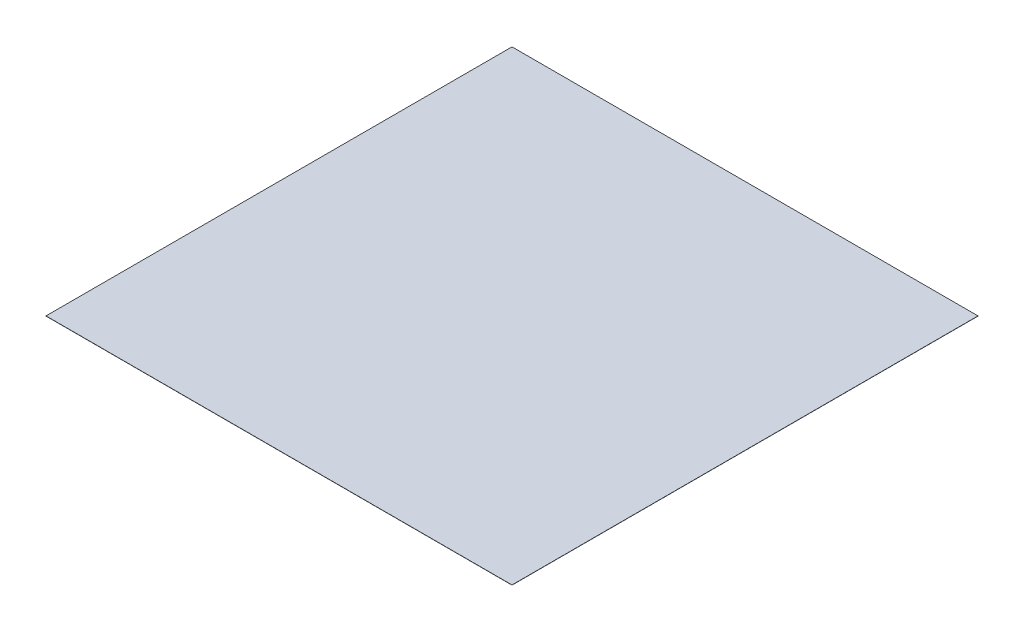
ISO-10303-21;
HEADER;
FILE_DESCRIPTION(('STEP AP214'),'2;1');
FILE_NAME('part.step','',(''),(''),'','','');
FILE_SCHEMA(('AUTOMOTIVE_DESIGN { 1 0 10303 214 1 1 1 1 }'));
ENDSEC;
DATA;
#1=APPLICATION_CONTEXT('core data for automotive mechanical design processes');
#2=APPLICATION_PROTOCOL_DEFINITION('international standard','automotive_design',2000,#1);
#3=PRODUCT_CONTEXT('',#1,'mechanical');
#4=PRODUCT('Part','Part','',(#3));
#5=PRODUCT_RELATED_PRODUCT_CATEGORY('part','',(#4));
#6=PRODUCT_DEFINITION_FORMATION('','',#4);
#7=PRODUCT_DEFINITION_CONTEXT('part definition',#1,'design');
#8=PRODUCT_DEFINITION('design','',#6,#7);
#9=PRODUCT_DEFINITION_SHAPE('','',#8);
#10=(LENGTH_UNIT() NAMED_UNIT(*) SI_UNIT(.MILLI.,.METRE.));
#11=(NAMED_UNIT(*) PLANE_ANGLE_UNIT() SI_UNIT($,.RADIAN.));
#12=(NAMED_UNIT(*) SI_UNIT($,.STERADIAN.) SOLID_ANGLE_UNIT());
#13=UNCERTAINTY_MEASURE_WITH_UNIT(LENGTH_MEASURE(1.E-05),#10,'distance_accuracy_value','');
#14=(GEOMETRIC_REPRESENTATION_CONTEXT(3) GLOBAL_UNCERTAINTY_ASSIGNED_CONTEXT((#13)) GLOBAL_UNIT_ASSIGNED_CONTEXT((#10,
#11,#12)) REPRESENTATION_CONTEXT('',''));
#15=CARTESIAN_POINT('',(0.,0.,0.));
#16=DIRECTION('',(0.,0.,1.));
#17=DIRECTION('',(1.,0.,0.));
#18=AXIS2_PLACEMENT_3D('',#15,#16,#17);
#19=CARTESIAN_POINT('',(2500.,2.,2500.));
#20=DIRECTION('',(-1.,0.,0.));
#21=DIRECTION('',(0.,0.,1.));
#22=AXIS2_PLACEMENT_3D('',#19,#20,#21);
#23=PLANE('',#22);
#24=DIRECTION('',(0.,0.,-1.));
#25=VECTOR('',#24,1.);
#26=CARTESIAN_POINT('',(2500.,0.,2500.));
#27=LINE('',#26,#25);
#28=CARTESIAN_POINT('',(2500.,0.,2500.));
#29=VERTEX_POINT('',#28);
#30=CARTESIAN_POINT('',(2500.,0.,-2500.));
#31=VERTEX_POINT('',#30);
#32=EDGE_CURVE('E107',#29,#31,#27,.T.);
#33=ORIENTED_EDGE('',*,*,#32,.T.);
#34=DIRECTION('',(0.,-1.,0.));
#35=VECTOR('',#34,1.);
#36=CARTESIAN_POINT('',(2500.,2.,-2500.));
#37=LINE('',#36,#35);
#38=CARTESIAN_POINT('',(2500.,2.,-2500.));
#39=VERTEX_POINT('',#38);
#40=EDGE_CURVE('E11',#39,#31,#37,.T.);
#41=ORIENTED_EDGE('',*,*,#40,.F.);
#42=DIRECTION('',(0.,0.,-1.));
#43=VECTOR('',#42,1.);
#44=CARTESIAN_POINT('',(2500.,2.,2500.));
#45=LINE('',#44,#43);
#46=CARTESIAN_POINT('',(2500.,2.,2500.));
#47=VERTEX_POINT('',#46);
#48=EDGE_CURVE('E91',#47,#39,#45,.T.);
#49=ORIENTED_EDGE('',*,*,#48,.F.);
#50=DIRECTION('',(0.,-1.,0.));
#51=VECTOR('',#50,1.);
#52=CARTESIAN_POINT('',(2500.,2.,2500.));
#53=LINE('',#52,#51);
#54=EDGE_CURVE('E103',#47,#29,#53,.T.);
#55=ORIENTED_EDGE('',*,*,#54,.T.);
#56=EDGE_LOOP('',(#33,#41,#49,#55));
#57=FACE_BOUND('',#56,.T.);
#58=ADVANCED_FACE('F39',(#57),#23,.F.);
#59=CARTESIAN_POINT('',(-2500.,2.,-2500.));
#60=DIRECTION('',(0.,0.,1.));
#61=DIRECTION('',(1.,0.,0.));
#62=AXIS2_PLACEMENT_3D('',#59,#60,#61);
#63=PLANE('',#62);
#64=DIRECTION('',(-1.,0.,0.));
#65=VECTOR('',#64,1.);
#66=CARTESIAN_POINT('',(-2500.,0.,-2500.));
#67=LINE('',#66,#65);
#68=CARTESIAN_POINT('',(-2500.,0.,-2500.));
#69=VERTEX_POINT('',#68);
#70=EDGE_CURVE('E96',#31,#69,#67,.T.);
#71=ORIENTED_EDGE('',*,*,#70,.T.);
#72=DIRECTION('',(0.,-1.,0.));
#73=VECTOR('',#72,1.);
#74=CARTESIAN_POINT('',(-2500.,2.,-2500.));
#75=LINE('',#74,#73);
#76=CARTESIAN_POINT('',(-2500.,2.,-2500.));
#77=VERTEX_POINT('',#76);
#78=EDGE_CURVE('E48',#77,#69,#75,.T.);
#79=ORIENTED_EDGE('',*,*,#78,.F.);
#80=DIRECTION('',(-1.,0.,0.));
#81=VECTOR('',#80,1.);
#82=CARTESIAN_POINT('',(-2500.,2.,-2500.));
#83=LINE('',#82,#81);
#84=EDGE_CURVE('E86',#39,#77,#83,.T.);
#85=ORIENTED_EDGE('',*,*,#84,.F.);
#86=ORIENTED_EDGE('',*,*,#40,.T.);
#87=EDGE_LOOP('',(#71,#79,#85,#86));
#88=FACE_BOUND('',#87,.T.);
#89=ADVANCED_FACE('F95',(#88),#63,.F.);
#90=CARTESIAN_POINT('',(-2500.,2.,2500.));
#91=DIRECTION('',(1.,0.,0.));
#92=DIRECTION('',(0.,0.,-1.));
#93=AXIS2_PLACEMENT_3D('',#90,#91,#92);
#94=PLANE('',#93);
#95=DIRECTION('',(0.,0.,1.));
#96=VECTOR('',#95,1.);
#97=CARTESIAN_POINT('',(-2500.,0.,2500.));
#98=LINE('',#97,#96);
#99=CARTESIAN_POINT('',(-2500.,0.,2500.));
#100=VERTEX_POINT('',#99);
#101=EDGE_CURVE('E73',#69,#100,#98,.T.);
#102=ORIENTED_EDGE('',*,*,#101,.T.);
#103=DIRECTION('',(0.,-1.,0.));
#104=VECTOR('',#103,1.);
#105=CARTESIAN_POINT('',(-2500.,2.,2500.));
#106=LINE('',#105,#104);
#107=CARTESIAN_POINT('',(-2500.,2.,2500.));
#108=VERTEX_POINT('',#107);
#109=EDGE_CURVE('E98',#108,#100,#106,.T.);
#110=ORIENTED_EDGE('',*,*,#109,.F.);
#111=DIRECTION('',(0.,0.,1.));
#112=VECTOR('',#111,1.);
#113=CARTESIAN_POINT('',(-2500.,2.,2500.));
#114=LINE('',#113,#112);
#115=EDGE_CURVE('E89',#77,#108,#114,.T.);
#116=ORIENTED_EDGE('',*,*,#115,.F.);
#117=ORIENTED_EDGE('',*,*,#78,.T.);
#118=EDGE_LOOP('',(#102,#110,#116,#117));
#119=FACE_BOUND('',#118,.T.);
#120=ADVANCED_FACE('F99',(#119),#94,.F.);
#121=CARTESIAN_POINT('',(-2500.,2.,2500.));
#122=DIRECTION('',(0.,0.,-1.));
#123=DIRECTION('',(-1.,0.,0.));
#124=AXIS2_PLACEMENT_3D('',#121,#122,#123);
#125=PLANE('',#124);
#126=DIRECTION('',(1.,0.,0.));
#127=VECTOR('',#126,1.);
#128=CARTESIAN_POINT('',(-2500.,0.,2500.));
#129=LINE('',#128,#127);
#130=EDGE_CURVE('E79',#100,#29,#129,.T.);
#131=ORIENTED_EDGE('',*,*,#130,.T.);
#132=ORIENTED_EDGE('',*,*,#54,.F.);
#133=DIRECTION('',(1.,0.,0.));
#134=VECTOR('',#133,1.);
#135=CARTESIAN_POINT('',(-2500.,2.,2500.));
#136=LINE('',#135,#134);
#137=EDGE_CURVE('E56',#108,#47,#136,.T.);
#138=ORIENTED_EDGE('',*,*,#137,.F.);
#139=ORIENTED_EDGE('',*,*,#109,.T.);
#140=EDGE_LOOP('',(#131,#132,#138,#139));
#141=FACE_BOUND('',#140,.T.);
#142=ADVANCED_FACE('F120',(#141),#125,.F.);
#143=CARTESIAN_POINT('',(0.,2.,0.));
#144=DIRECTION('',(0.,-1.,0.));
#145=DIRECTION('',(0.,0.,-1.));
#146=AXIS2_PLACEMENT_3D('',#143,#144,#145);
#147=PLANE('',#146);
#148=ORIENTED_EDGE('',*,*,#48,.T.);
#149=ORIENTED_EDGE('',*,*,#84,.T.);
#150=ORIENTED_EDGE('',*,*,#115,.T.);
#151=ORIENTED_EDGE('',*,*,#137,.T.);
#152=EDGE_LOOP('',(#148,#149,#150,#151));
#153=FACE_BOUND('',#152,.T.);
#154=ADVANCED_FACE('F87',(#153),#147,.F.);
#155=CARTESIAN_POINT('',(0.,0.,0.));
#156=DIRECTION('',(0.,-1.,0.));
#157=DIRECTION('',(0.,0.,-1.));
#158=AXIS2_PLACEMENT_3D('',#155,#156,#157);
#159=PLANE('',#158);
#160=ORIENTED_EDGE('',*,*,#32,.F.);
#161=ORIENTED_EDGE('',*,*,#130,.F.);
#162=ORIENTED_EDGE('',*,*,#101,.F.);
#163=ORIENTED_EDGE('',*,*,#70,.F.);
#164=EDGE_LOOP('',(#160,#161,#162,#163));
#165=FACE_BOUND('',#164,.T.);
#166=ADVANCED_FACE('F123',(#165),#159,.T.);
#167=CLOSED_SHELL('',(#58,#89,#120,#142,#154,#166));
#168=MANIFOLD_SOLID_BREP('B2',#167);
#169=ADVANCED_BREP_SHAPE_REPRESENTATION('',(#18,#168),#14);
#170=SHAPE_DEFINITION_REPRESENTATION(#9,#169);
ENDSEC;
END-ISO-10303-21;
